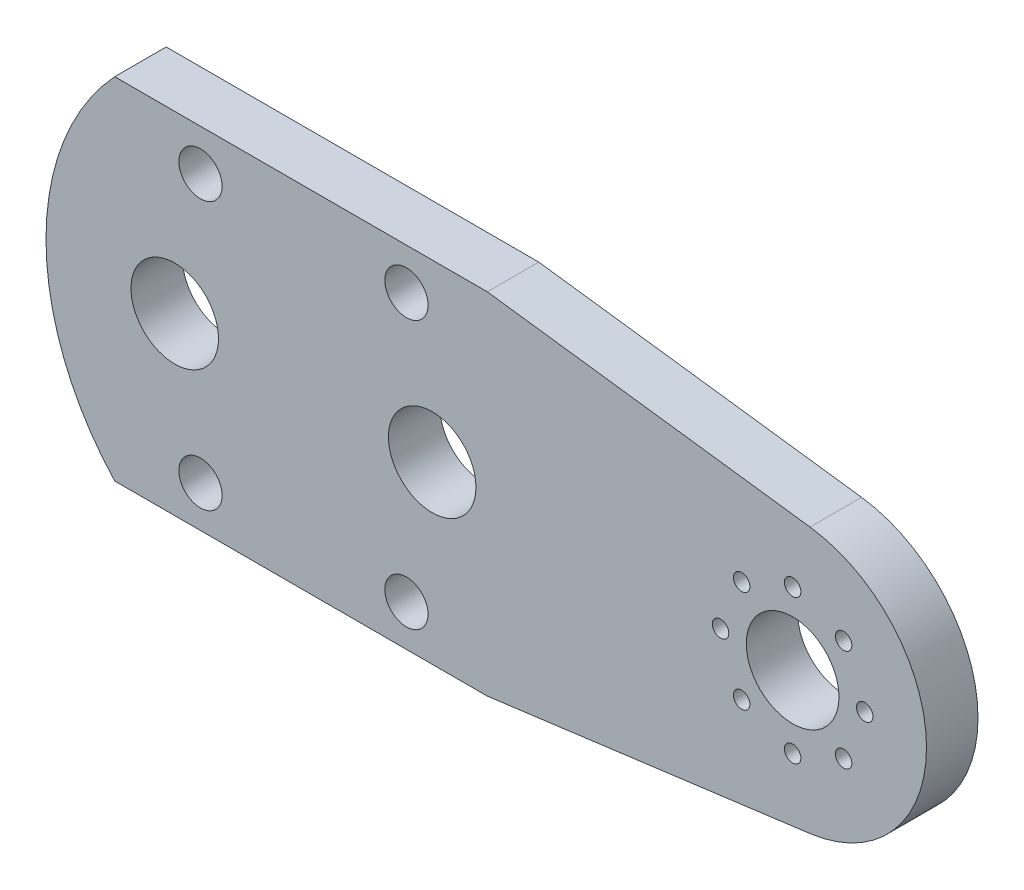
ISO-10303-21;
HEADER;
FILE_DESCRIPTION(('STEP AP214'),'2;1');
FILE_NAME('part.step','',(''),(''),'','','');
FILE_SCHEMA(('AUTOMOTIVE_DESIGN { 1 0 10303 214 1 1 1 1 }'));
ENDSEC;
DATA;
#1=APPLICATION_CONTEXT('core data for automotive mechanical design processes');
#2=APPLICATION_PROTOCOL_DEFINITION('international standard','automotive_design',2000,#1);
#3=PRODUCT_CONTEXT('',#1,'mechanical');
#4=PRODUCT('Part','Part','',(#3));
#5=PRODUCT_RELATED_PRODUCT_CATEGORY('part','',(#4));
#6=PRODUCT_DEFINITION_FORMATION('','',#4);
#7=PRODUCT_DEFINITION_CONTEXT('part definition',#1,'design');
#8=PRODUCT_DEFINITION('design','',#6,#7);
#9=PRODUCT_DEFINITION_SHAPE('','',#8);
#10=(LENGTH_UNIT() NAMED_UNIT(*) SI_UNIT(.MILLI.,.METRE.));
#11=(NAMED_UNIT(*) PLANE_ANGLE_UNIT() SI_UNIT($,.RADIAN.));
#12=(NAMED_UNIT(*) SI_UNIT($,.STERADIAN.) SOLID_ANGLE_UNIT());
#13=UNCERTAINTY_MEASURE_WITH_UNIT(LENGTH_MEASURE(1.E-05),#10,'distance_accuracy_value','');
#14=(GEOMETRIC_REPRESENTATION_CONTEXT(3) GLOBAL_UNCERTAINTY_ASSIGNED_CONTEXT((#13)) GLOBAL_UNIT_ASSIGNED_CONTEXT((#10,
#11,#12)) REPRESENTATION_CONTEXT('',''));
#15=CARTESIAN_POINT('',(0.,0.,0.));
#16=DIRECTION('',(0.,0.,1.));
#17=DIRECTION('',(1.,0.,0.));
#18=AXIS2_PLACEMENT_3D('',#15,#16,#17);
#19=CARTESIAN_POINT('',(2.28268021658433,-17.4028007841061,5.));
#20=DIRECTION('',(-0.130053398949487,0.991506991110847,0.));
#21=DIRECTION('',(-0.991506991110847,-0.130053398949487,0.));
#22=AXIS2_PLACEMENT_3D('',#19,#20,#21);
#23=PLANE('',#22);
#24=DIRECTION('',(0.991506991110847,0.130053398949487,0.));
#25=VECTOR('',#24,1.);
#26=CARTESIAN_POINT('',(2.28268021658433,-17.4028007841061,0.));
#27=LINE('',#26,#25);
#28=CARTESIAN_POINT('',(5.35357107135713,-17.,0.));
#29=VERTEX_POINT('',#28);
#30=CARTESIAN_POINT('',(36.6906941863433,-12.889590884441,0.));
#31=VERTEX_POINT('',#30);
#32=EDGE_CURVE('E165',#29,#31,#27,.T.);
#33=ORIENTED_EDGE('',*,*,#32,.T.);
#34=DIRECTION('',(0.,0.,-1.));
#35=VECTOR('',#34,1.);
#36=CARTESIAN_POINT('',(36.6906941863433,-12.889590884441,5.));
#37=LINE('',#36,#35);
#38=CARTESIAN_POINT('',(36.6906941863433,-12.889590884441,5.));
#39=VERTEX_POINT('',#38);
#40=EDGE_CURVE('E11',#39,#31,#37,.T.);
#41=ORIENTED_EDGE('',*,*,#40,.F.);
#42=DIRECTION('',(0.991506991110847,0.130053398949487,0.));
#43=VECTOR('',#42,1.);
#44=CARTESIAN_POINT('',(2.28268021658433,-17.4028007841061,5.));
#45=LINE('',#44,#43);
#46=CARTESIAN_POINT('',(5.35357107135713,-17.,5.));
#47=VERTEX_POINT('',#46);
#48=EDGE_CURVE('E218',#47,#39,#45,.T.);
#49=ORIENTED_EDGE('',*,*,#48,.F.);
#50=DIRECTION('',(0.,0.,-1.));
#51=VECTOR('',#50,1.);
#52=CARTESIAN_POINT('',(5.35357107135713,-17.,5.));
#53=LINE('',#52,#51);
#54=EDGE_CURVE('E146',#47,#29,#53,.T.);
#55=ORIENTED_EDGE('',*,*,#54,.T.);
#56=EDGE_LOOP('',(#33,#41,#49,#55));
#57=FACE_BOUND('',#56,.T.);
#58=ADVANCED_FACE('F34',(#57),#23,.F.);
#59=CARTESIAN_POINT('',(35.,0.,5.));
#60=DIRECTION('',(0.,0.,-1.));
#61=DIRECTION('',(-1.,0.,0.));
#62=AXIS2_PLACEMENT_3D('',#59,#60,#61);
#63=CYLINDRICAL_SURFACE('',#62,13.);
#64=CARTESIAN_POINT('',(35.,0.,0.));
#65=DIRECTION('',(0.,0.,1.));
#66=DIRECTION('',(1.,0.,0.));
#67=AXIS2_PLACEMENT_3D('',#64,#65,#66);
#68=CIRCLE('',#67,13.);
#69=CARTESIAN_POINT('',(36.6906941863433,12.889590884441,0.));
#70=VERTEX_POINT('',#69);
#71=EDGE_CURVE('E168',#31,#70,#68,.T.);
#72=ORIENTED_EDGE('',*,*,#71,.T.);
#73=DIRECTION('',(0.,0.,-1.));
#74=VECTOR('',#73,1.);
#75=CARTESIAN_POINT('',(36.6906941863433,12.889590884441,5.));
#76=LINE('',#75,#74);
#77=CARTESIAN_POINT('',(36.6906941863433,12.889590884441,5.));
#78=VERTEX_POINT('',#77);
#79=EDGE_CURVE('E43',#78,#70,#76,.T.);
#80=ORIENTED_EDGE('',*,*,#79,.F.);
#81=CARTESIAN_POINT('',(35.,0.,5.));
#82=DIRECTION('',(0.,0.,1.));
#83=DIRECTION('',(1.,0.,0.));
#84=AXIS2_PLACEMENT_3D('',#81,#82,#83);
#85=CIRCLE('',#84,13.);
#86=EDGE_CURVE('E87',#39,#78,#85,.T.);
#87=ORIENTED_EDGE('',*,*,#86,.F.);
#88=ORIENTED_EDGE('',*,*,#40,.T.);
#89=EDGE_LOOP('',(#72,#80,#87,#88));
#90=FACE_BOUND('',#89,.T.);
#91=ADVANCED_FACE('F210',(#90),#63,.T.);
#92=CARTESIAN_POINT('',(2.28268021658433,17.4028007841061,5.));
#93=DIRECTION('',(0.130053398949487,0.991506991110847,0.));
#94=DIRECTION('',(-0.991506991110847,0.130053398949487,0.));
#95=AXIS2_PLACEMENT_3D('',#92,#93,#94);
#96=PLANE('',#95);
#97=DIRECTION('',(0.991506991110847,-0.130053398949487,0.));
#98=VECTOR('',#97,1.);
#99=CARTESIAN_POINT('',(2.28268021658433,17.4028007841061,0.));
#100=LINE('',#99,#98);
#101=CARTESIAN_POINT('',(5.35357107135713,17.,0.));
#102=VERTEX_POINT('',#101);
#103=EDGE_CURVE('E171',#102,#70,#100,.T.);
#104=ORIENTED_EDGE('',*,*,#103,.F.);
#105=DIRECTION('',(0.,0.,-1.));
#106=VECTOR('',#105,1.);
#107=CARTESIAN_POINT('',(5.35357107135713,17.,5.));
#108=LINE('',#107,#106);
#109=CARTESIAN_POINT('',(5.35357107135713,17.,5.));
#110=VERTEX_POINT('',#109);
#111=EDGE_CURVE('E103',#110,#102,#108,.T.);
#112=ORIENTED_EDGE('',*,*,#111,.F.);
#113=DIRECTION('',(0.991506991110847,-0.130053398949487,0.));
#114=VECTOR('',#113,1.);
#115=CARTESIAN_POINT('',(2.28268021658433,17.4028007841061,5.));
#116=LINE('',#115,#114);
#117=EDGE_CURVE('E113',#110,#78,#116,.T.);
#118=ORIENTED_EDGE('',*,*,#117,.T.);
#119=ORIENTED_EDGE('',*,*,#79,.T.);
#120=EDGE_LOOP('',(#104,#112,#118,#119));
#121=FACE_BOUND('',#120,.T.);
#122=ADVANCED_FACE('F209',(#121),#96,.T.);
#123=CARTESIAN_POINT('',(0.,17.,5.));
#124=DIRECTION('',(0.,1.,0.));
#125=DIRECTION('',(0.,0.,1.));
#126=AXIS2_PLACEMENT_3D('',#123,#124,#125);
#127=PLANE('',#126);
#128=DIRECTION('',(1.,0.,0.));
#129=VECTOR('',#128,1.);
#130=CARTESIAN_POINT('',(0.,17.,0.));
#131=LINE('',#130,#129);
#132=CARTESIAN_POINT('',(-30.8303027798234,17.,0.));
#133=VERTEX_POINT('',#132);
#134=EDGE_CURVE('E102',#133,#102,#131,.T.);
#135=ORIENTED_EDGE('',*,*,#134,.F.);
#136=DIRECTION('',(0.,0.,-1.));
#137=VECTOR('',#136,1.);
#138=CARTESIAN_POINT('',(-30.8303027798234,17.,5.));
#139=LINE('',#138,#137);
#140=CARTESIAN_POINT('',(-30.8303027798234,17.,5.));
#141=VERTEX_POINT('',#140);
#142=EDGE_CURVE('E96',#141,#133,#139,.T.);
#143=ORIENTED_EDGE('',*,*,#142,.F.);
#144=DIRECTION('',(1.,0.,0.));
#145=VECTOR('',#144,1.);
#146=CARTESIAN_POINT('',(0.,17.,5.));
#147=LINE('',#146,#145);
#148=EDGE_CURVE('E100',#141,#110,#147,.T.);
#149=ORIENTED_EDGE('',*,*,#148,.T.);
#150=ORIENTED_EDGE('',*,*,#111,.T.);
#151=EDGE_LOOP('',(#135,#143,#149,#150));
#152=FACE_BOUND('',#151,.T.);
#153=ADVANCED_FACE('F98',(#152),#127,.T.);
#154=CARTESIAN_POINT('',(-12.5,0.,5.));
#155=DIRECTION('',(0.,0.,-1.));
#156=DIRECTION('',(-1.,0.,0.));
#157=AXIS2_PLACEMENT_3D('',#154,#155,#156);
#158=CYLINDRICAL_SURFACE('',#157,25.);
#159=CARTESIAN_POINT('',(-12.5,0.,0.));
#160=DIRECTION('',(0.,0.,1.));
#161=DIRECTION('',(1.,0.,0.));
#162=AXIS2_PLACEMENT_3D('',#159,#160,#161);
#163=CIRCLE('',#162,25.);
#164=CARTESIAN_POINT('',(-30.8303027798234,-17.,0.));
#165=VERTEX_POINT('',#164);
#166=EDGE_CURVE('E73',#133,#165,#163,.T.);
#167=ORIENTED_EDGE('',*,*,#166,.T.);
#168=DIRECTION('',(0.,0.,-1.));
#169=VECTOR('',#168,1.);
#170=CARTESIAN_POINT('',(-30.8303027798234,-17.,5.));
#171=LINE('',#170,#169);
#172=CARTESIAN_POINT('',(-30.8303027798234,-17.,5.));
#173=VERTEX_POINT('',#172);
#174=EDGE_CURVE('E104',#173,#165,#171,.T.);
#175=ORIENTED_EDGE('',*,*,#174,.F.);
#176=CARTESIAN_POINT('',(-12.5,0.,5.));
#177=DIRECTION('',(0.,0.,1.));
#178=DIRECTION('',(1.,0.,0.));
#179=AXIS2_PLACEMENT_3D('',#176,#177,#178);
#180=CIRCLE('',#179,25.);
#181=EDGE_CURVE('E106',#141,#173,#180,.T.);
#182=ORIENTED_EDGE('',*,*,#181,.F.);
#183=ORIENTED_EDGE('',*,*,#142,.T.);
#184=EDGE_LOOP('',(#167,#175,#182,#183));
#185=FACE_BOUND('',#184,.T.);
#186=ADVANCED_FACE('F107',(#185),#158,.T.);
#187=CARTESIAN_POINT('',(30.0502525316942,4.94974746830584,5.));
#188=DIRECTION('',(0.,0.,-1.));
#189=DIRECTION('',(-1.,0.,0.));
#190=AXIS2_PLACEMENT_3D('',#187,#188,#189);
#191=CYLINDRICAL_SURFACE('',#190,0.800000000000002);
#192=CARTESIAN_POINT('',(30.0502525316942,4.94974746830584,5.));
#193=DIRECTION('',(0.,0.,1.));
#194=DIRECTION('',(1.,0.,0.));
#195=AXIS2_PLACEMENT_3D('',#192,#193,#194);
#196=CIRCLE('',#195,0.800000000000002);
#197=CARTESIAN_POINT('',(30.8502525316942,4.94974746830584,5.));
#198=VERTEX_POINT('',#197);
#199=EDGE_CURVE('E140',#198,#198,#196,.T.);
#200=ORIENTED_EDGE('',*,*,#199,.T.);
#201=EDGE_LOOP('',(#200));
#202=FACE_BOUND('',#201,.T.);
#203=CARTESIAN_POINT('',(30.0502525316942,4.94974746830584,0.));
#204=DIRECTION('',(0.,0.,1.));
#205=DIRECTION('',(1.,0.,0.));
#206=AXIS2_PLACEMENT_3D('',#203,#204,#205);
#207=CIRCLE('',#206,0.800000000000002);
#208=CARTESIAN_POINT('',(30.8502525316942,4.94974746830584,0.));
#209=VERTEX_POINT('',#208);
#210=EDGE_CURVE('E198',#209,#209,#207,.T.);
#211=ORIENTED_EDGE('',*,*,#210,.F.);
#212=EDGE_LOOP('',(#211));
#213=FACE_BOUND('',#212,.T.);
#214=ADVANCED_FACE('F292',(#202,#213),#191,.F.);
#215=CARTESIAN_POINT('',(28.,0.,5.));
#216=DIRECTION('',(0.,0.,-1.));
#217=DIRECTION('',(-1.,0.,0.));
#218=AXIS2_PLACEMENT_3D('',#215,#216,#217);
#219=CYLINDRICAL_SURFACE('',#218,0.8);
#220=CARTESIAN_POINT('',(28.,0.,5.));
#221=DIRECTION('',(0.,0.,1.));
#222=DIRECTION('',(1.,0.,0.));
#223=AXIS2_PLACEMENT_3D('',#220,#221,#222);
#224=CIRCLE('',#223,0.8);
#225=CARTESIAN_POINT('',(28.8,0.,5.));
#226=VERTEX_POINT('',#225);
#227=EDGE_CURVE('E137',#226,#226,#224,.T.);
#228=ORIENTED_EDGE('',*,*,#227,.T.);
#229=EDGE_LOOP('',(#228));
#230=FACE_BOUND('',#229,.T.);
#231=CARTESIAN_POINT('',(28.,0.,0.));
#232=DIRECTION('',(0.,0.,1.));
#233=DIRECTION('',(1.,0.,0.));
#234=AXIS2_PLACEMENT_3D('',#231,#232,#233);
#235=CIRCLE('',#234,0.8);
#236=CARTESIAN_POINT('',(28.8,0.,0.));
#237=VERTEX_POINT('',#236);
#238=EDGE_CURVE('E195',#237,#237,#235,.T.);
#239=ORIENTED_EDGE('',*,*,#238,.F.);
#240=EDGE_LOOP('',(#239));
#241=FACE_BOUND('',#240,.T.);
#242=ADVANCED_FACE('F295',(#230,#241),#219,.F.);
#243=CARTESIAN_POINT('',(30.0502525316941,-4.94974746830577,5.));
#244=DIRECTION('',(0.,0.,-1.));
#245=DIRECTION('',(-1.,0.,0.));
#246=AXIS2_PLACEMENT_3D('',#243,#244,#245);
#247=CYLINDRICAL_SURFACE('',#246,0.800000000000002);
#248=CARTESIAN_POINT('',(30.0502525316941,-4.94974746830577,5.));
#249=DIRECTION('',(0.,0.,1.));
#250=DIRECTION('',(1.,0.,0.));
#251=AXIS2_PLACEMENT_3D('',#248,#249,#250);
#252=CIRCLE('',#251,0.800000000000002);
#253=CARTESIAN_POINT('',(30.8502525316941,-4.94974746830577,5.));
#254=VERTEX_POINT('',#253);
#255=EDGE_CURVE('E134',#254,#254,#252,.T.);
#256=ORIENTED_EDGE('',*,*,#255,.T.);
#257=EDGE_LOOP('',(#256));
#258=FACE_BOUND('',#257,.T.);
#259=CARTESIAN_POINT('',(30.0502525316941,-4.94974746830577,0.));
#260=DIRECTION('',(0.,0.,1.));
#261=DIRECTION('',(1.,0.,0.));
#262=AXIS2_PLACEMENT_3D('',#259,#260,#261);
#263=CIRCLE('',#262,0.800000000000002);
#264=CARTESIAN_POINT('',(30.8502525316941,-4.94974746830577,0.));
#265=VERTEX_POINT('',#264);
#266=EDGE_CURVE('E192',#265,#265,#263,.T.);
#267=ORIENTED_EDGE('',*,*,#266,.F.);
#268=EDGE_LOOP('',(#267));
#269=FACE_BOUND('',#268,.T.);
#270=ADVANCED_FACE('F299',(#258,#269),#247,.F.);
#271=CARTESIAN_POINT('',(34.9999999999999,-7.,5.));
#272=DIRECTION('',(0.,0.,-1.));
#273=DIRECTION('',(-1.,0.,0.));
#274=AXIS2_PLACEMENT_3D('',#271,#272,#273);
#275=CYLINDRICAL_SURFACE('',#274,0.799999999999999);
#276=CARTESIAN_POINT('',(34.9999999999999,-7.,5.));
#277=DIRECTION('',(0.,0.,1.));
#278=DIRECTION('',(1.,0.,0.));
#279=AXIS2_PLACEMENT_3D('',#276,#277,#278);
#280=CIRCLE('',#279,0.799999999999999);
#281=CARTESIAN_POINT('',(35.7999999999999,-7.,5.));
#282=VERTEX_POINT('',#281);
#283=EDGE_CURVE('E131',#282,#282,#280,.T.);
#284=ORIENTED_EDGE('',*,*,#283,.T.);
#285=EDGE_LOOP('',(#284));
#286=FACE_BOUND('',#285,.T.);
#287=CARTESIAN_POINT('',(34.9999999999999,-7.,0.));
#288=DIRECTION('',(0.,0.,1.));
#289=DIRECTION('',(1.,0.,0.));
#290=AXIS2_PLACEMENT_3D('',#287,#288,#289);
#291=CIRCLE('',#290,0.799999999999999);
#292=CARTESIAN_POINT('',(35.7999999999999,-7.,0.));
#293=VERTEX_POINT('',#292);
#294=EDGE_CURVE('E189',#293,#293,#291,.T.);
#295=ORIENTED_EDGE('',*,*,#294,.F.);
#296=EDGE_LOOP('',(#295));
#297=FACE_BOUND('',#296,.T.);
#298=ADVANCED_FACE('F303',(#286,#297),#275,.F.);
#299=CARTESIAN_POINT('',(39.9497474683058,-4.94974746830588,5.));
#300=DIRECTION('',(0.,0.,-1.));
#301=DIRECTION('',(-1.,0.,0.));
#302=AXIS2_PLACEMENT_3D('',#299,#300,#301);
#303=CYLINDRICAL_SURFACE('',#302,0.799999999999999);
#304=CARTESIAN_POINT('',(39.9497474683058,-4.94974746830588,5.));
#305=DIRECTION('',(0.,0.,1.));
#306=DIRECTION('',(1.,0.,0.));
#307=AXIS2_PLACEMENT_3D('',#304,#305,#306);
#308=CIRCLE('',#307,0.799999999999999);
#309=CARTESIAN_POINT('',(40.7497474683058,-4.94974746830588,5.));
#310=VERTEX_POINT('',#309);
#311=EDGE_CURVE('E128',#310,#310,#308,.T.);
#312=ORIENTED_EDGE('',*,*,#311,.T.);
#313=EDGE_LOOP('',(#312));
#314=FACE_BOUND('',#313,.T.);
#315=CARTESIAN_POINT('',(39.9497474683058,-4.94974746830588,0.));
#316=DIRECTION('',(0.,0.,1.));
#317=DIRECTION('',(1.,0.,0.));
#318=AXIS2_PLACEMENT_3D('',#315,#316,#317);
#319=CIRCLE('',#318,0.799999999999999);
#320=CARTESIAN_POINT('',(40.7497474683058,-4.94974746830588,0.));
#321=VERTEX_POINT('',#320);
#322=EDGE_CURVE('E186',#321,#321,#319,.T.);
#323=ORIENTED_EDGE('',*,*,#322,.F.);
#324=EDGE_LOOP('',(#323));
#325=FACE_BOUND('',#324,.T.);
#326=ADVANCED_FACE('F307',(#314,#325),#303,.F.);
#327=CARTESIAN_POINT('',(42.,0.,5.));
#328=DIRECTION('',(0.,0.,-1.));
#329=DIRECTION('',(-1.,0.,0.));
#330=AXIS2_PLACEMENT_3D('',#327,#328,#329);
#331=CYLINDRICAL_SURFACE('',#330,0.800000000000002);
#332=CARTESIAN_POINT('',(42.,0.,5.));
#333=DIRECTION('',(0.,0.,1.));
#334=DIRECTION('',(1.,0.,0.));
#335=AXIS2_PLACEMENT_3D('',#332,#333,#334);
#336=CIRCLE('',#335,0.800000000000002);
#337=CARTESIAN_POINT('',(42.8,0.,5.));
#338=VERTEX_POINT('',#337);
#339=EDGE_CURVE('E125',#338,#338,#336,.T.);
#340=ORIENTED_EDGE('',*,*,#339,.T.);
#341=EDGE_LOOP('',(#340));
#342=FACE_BOUND('',#341,.T.);
#343=CARTESIAN_POINT('',(42.,0.,0.));
#344=DIRECTION('',(0.,0.,1.));
#345=DIRECTION('',(1.,0.,0.));
#346=AXIS2_PLACEMENT_3D('',#343,#344,#345);
#347=CIRCLE('',#346,0.800000000000002);
#348=CARTESIAN_POINT('',(42.8,0.,0.));
#349=VERTEX_POINT('',#348);
#350=EDGE_CURVE('E183',#349,#349,#347,.T.);
#351=ORIENTED_EDGE('',*,*,#350,.F.);
#352=EDGE_LOOP('',(#351));
#353=FACE_BOUND('',#352,.T.);
#354=ADVANCED_FACE('F311',(#342,#353),#331,.F.);
#355=CARTESIAN_POINT('',(39.9497474683059,4.9497474683058,5.));
#356=DIRECTION('',(0.,0.,-1.));
#357=DIRECTION('',(-1.,0.,0.));
#358=AXIS2_PLACEMENT_3D('',#355,#356,#357);
#359=CYLINDRICAL_SURFACE('',#358,0.799999999999999);
#360=CARTESIAN_POINT('',(39.9497474683059,4.9497474683058,5.));
#361=DIRECTION('',(0.,0.,1.));
#362=DIRECTION('',(1.,0.,0.));
#363=AXIS2_PLACEMENT_3D('',#360,#361,#362);
#364=CIRCLE('',#363,0.799999999999999);
#365=CARTESIAN_POINT('',(40.7497474683059,4.9497474683058,5.));
#366=VERTEX_POINT('',#365);
#367=EDGE_CURVE('E122',#366,#366,#364,.T.);
#368=ORIENTED_EDGE('',*,*,#367,.T.);
#369=EDGE_LOOP('',(#368));
#370=FACE_BOUND('',#369,.T.);
#371=CARTESIAN_POINT('',(39.9497474683059,4.9497474683058,0.));
#372=DIRECTION('',(0.,0.,1.));
#373=DIRECTION('',(1.,0.,0.));
#374=AXIS2_PLACEMENT_3D('',#371,#372,#373);
#375=CIRCLE('',#374,0.799999999999999);
#376=CARTESIAN_POINT('',(40.7497474683059,4.9497474683058,0.));
#377=VERTEX_POINT('',#376);
#378=EDGE_CURVE('E180',#377,#377,#375,.T.);
#379=ORIENTED_EDGE('',*,*,#378,.F.);
#380=EDGE_LOOP('',(#379));
#381=FACE_BOUND('',#380,.T.);
#382=ADVANCED_FACE('F231',(#370,#381),#359,.F.);
#383=CARTESIAN_POINT('',(35.,7.,5.));
#384=DIRECTION('',(0.,0.,-1.));
#385=DIRECTION('',(-1.,0.,0.));
#386=AXIS2_PLACEMENT_3D('',#383,#384,#385);
#387=CYLINDRICAL_SURFACE('',#386,0.800000000000002);
#388=CARTESIAN_POINT('',(35.,7.,5.));
#389=DIRECTION('',(0.,0.,1.));
#390=DIRECTION('',(1.,0.,0.));
#391=AXIS2_PLACEMENT_3D('',#388,#389,#390);
#392=CIRCLE('',#391,0.800000000000002);
#393=CARTESIAN_POINT('',(35.8,7.,5.));
#394=VERTEX_POINT('',#393);
#395=EDGE_CURVE('E119',#394,#394,#392,.T.);
#396=ORIENTED_EDGE('',*,*,#395,.T.);
#397=EDGE_LOOP('',(#396));
#398=FACE_BOUND('',#397,.T.);
#399=CARTESIAN_POINT('',(35.,7.,0.));
#400=DIRECTION('',(0.,0.,1.));
#401=DIRECTION('',(1.,0.,0.));
#402=AXIS2_PLACEMENT_3D('',#399,#400,#401);
#403=CIRCLE('',#402,0.800000000000002);
#404=CARTESIAN_POINT('',(35.8,7.,0.));
#405=VERTEX_POINT('',#404);
#406=EDGE_CURVE('E177',#405,#405,#403,.T.);
#407=ORIENTED_EDGE('',*,*,#406,.F.);
#408=EDGE_LOOP('',(#407));
#409=FACE_BOUND('',#408,.T.);
#410=ADVANCED_FACE('F222',(#398,#409),#387,.F.);
#411=CARTESIAN_POINT('',(0.,-17.,5.));
#412=DIRECTION('',(0.,1.,0.));
#413=DIRECTION('',(0.,0.,1.));
#414=AXIS2_PLACEMENT_3D('',#411,#412,#413);
#415=PLANE('',#414);
#416=DIRECTION('',(1.,0.,0.));
#417=VECTOR('',#416,1.);
#418=CARTESIAN_POINT('',(0.,-17.,0.));
#419=LINE('',#418,#417);
#420=EDGE_CURVE('E79',#165,#29,#419,.T.);
#421=ORIENTED_EDGE('',*,*,#420,.T.);
#422=ORIENTED_EDGE('',*,*,#54,.F.);
#423=DIRECTION('',(1.,0.,0.));
#424=VECTOR('',#423,1.);
#425=CARTESIAN_POINT('',(0.,-17.,5.));
#426=LINE('',#425,#424);
#427=EDGE_CURVE('E51',#173,#47,#426,.T.);
#428=ORIENTED_EDGE('',*,*,#427,.F.);
#429=ORIENTED_EDGE('',*,*,#174,.T.);
#430=EDGE_LOOP('',(#421,#422,#428,#429));
#431=FACE_BOUND('',#430,.T.);
#432=ADVANCED_FACE('F219',(#431),#415,.F.);
#433=CARTESIAN_POINT('',(-2.5,-13.,5.));
#434=DIRECTION('',(0.,0.,-1.));
#435=DIRECTION('',(-1.,0.,0.));
#436=AXIS2_PLACEMENT_3D('',#433,#434,#435);
#437=CYLINDRICAL_SURFACE('',#436,2.1);
#438=CARTESIAN_POINT('',(-2.5,-13.,5.));
#439=DIRECTION('',(0.,0.,1.));
#440=DIRECTION('',(1.,0.,0.));
#441=AXIS2_PLACEMENT_3D('',#438,#439,#440);
#442=CIRCLE('',#441,2.1);
#443=CARTESIAN_POINT('',(-0.399999999999998,-13.,5.));
#444=VERTEX_POINT('',#443);
#445=EDGE_CURVE('E544',#444,#444,#442,.F.);
#446=ORIENTED_EDGE('',*,*,#445,.F.);
#447=EDGE_LOOP('',(#446));
#448=FACE_BOUND('',#447,.T.);
#449=CARTESIAN_POINT('',(-2.5,-13.,0.));
#450=DIRECTION('',(0.,0.,1.));
#451=DIRECTION('',(1.,0.,0.));
#452=AXIS2_PLACEMENT_3D('',#449,#450,#451);
#453=CIRCLE('',#452,2.1);
#454=CARTESIAN_POINT('',(-0.399999999999998,-13.,0.));
#455=VERTEX_POINT('',#454);
#456=EDGE_CURVE('E162',#455,#455,#453,.F.);
#457=ORIENTED_EDGE('',*,*,#456,.T.);
#458=EDGE_LOOP('',(#457));
#459=FACE_BOUND('',#458,.T.);
#460=ADVANCED_FACE('F221',(#448,#459),#437,.F.);
#461=CARTESIAN_POINT('',(-22.5,-13.,5.));
#462=DIRECTION('',(0.,0.,-1.));
#463=DIRECTION('',(-1.,0.,0.));
#464=AXIS2_PLACEMENT_3D('',#461,#462,#463);
#465=CYLINDRICAL_SURFACE('',#464,2.1);
#466=CARTESIAN_POINT('',(-22.5,-13.,5.));
#467=DIRECTION('',(0.,0.,1.));
#468=DIRECTION('',(1.,0.,0.));
#469=AXIS2_PLACEMENT_3D('',#466,#467,#468);
#470=CIRCLE('',#469,2.1);
#471=CARTESIAN_POINT('',(-20.4,-13.,5.));
#472=VERTEX_POINT('',#471);
#473=EDGE_CURVE('E541',#472,#472,#470,.T.);
#474=ORIENTED_EDGE('',*,*,#473,.T.);
#475=EDGE_LOOP('',(#474));
#476=FACE_BOUND('',#475,.T.);
#477=CARTESIAN_POINT('',(-22.5,-13.,0.));
#478=DIRECTION('',(0.,0.,1.));
#479=DIRECTION('',(1.,0.,0.));
#480=AXIS2_PLACEMENT_3D('',#477,#478,#479);
#481=CIRCLE('',#480,2.1);
#482=CARTESIAN_POINT('',(-20.4,-13.,0.));
#483=VERTEX_POINT('',#482);
#484=EDGE_CURVE('E159',#483,#483,#481,.T.);
#485=ORIENTED_EDGE('',*,*,#484,.F.);
#486=EDGE_LOOP('',(#485));
#487=FACE_BOUND('',#486,.T.);
#488=ADVANCED_FACE('F228',(#476,#487),#465,.F.);
#489=CARTESIAN_POINT('',(-25.,0.,5.));
#490=DIRECTION('',(0.,0.,-1.));
#491=DIRECTION('',(-1.,0.,0.));
#492=AXIS2_PLACEMENT_3D('',#489,#490,#491);
#493=CYLINDRICAL_SURFACE('',#492,4.25);
#494=CARTESIAN_POINT('',(-25.,0.,5.));
#495=DIRECTION('',(0.,0.,1.));
#496=DIRECTION('',(1.,0.,0.));
#497=AXIS2_PLACEMENT_3D('',#494,#495,#496);
#498=CIRCLE('',#497,4.25);
#499=CARTESIAN_POINT('',(-20.75,0.,5.));
#500=VERTEX_POINT('',#499);
#501=EDGE_CURVE('E537',#500,#500,#498,.T.);
#502=ORIENTED_EDGE('',*,*,#501,.T.);
#503=EDGE_LOOP('',(#502));
#504=FACE_BOUND('',#503,.T.);
#505=CARTESIAN_POINT('',(-25.,0.,0.));
#506=DIRECTION('',(0.,0.,1.));
#507=DIRECTION('',(1.,0.,0.));
#508=AXIS2_PLACEMENT_3D('',#505,#506,#507);
#509=CIRCLE('',#508,4.25);
#510=CARTESIAN_POINT('',(-20.75,0.,0.));
#511=VERTEX_POINT('',#510);
#512=EDGE_CURVE('E156',#511,#511,#509,.T.);
#513=ORIENTED_EDGE('',*,*,#512,.F.);
#514=EDGE_LOOP('',(#513));
#515=FACE_BOUND('',#514,.T.);
#516=ADVANCED_FACE('F245',(#504,#515),#493,.F.);
#517=CARTESIAN_POINT('',(0.,0.,5.));
#518=DIRECTION('',(0.,0.,-1.));
#519=DIRECTION('',(-1.,0.,0.));
#520=AXIS2_PLACEMENT_3D('',#517,#518,#519);
#521=CYLINDRICAL_SURFACE('',#520,4.25);
#522=CARTESIAN_POINT('',(0.,0.,5.));
#523=DIRECTION('',(0.,0.,1.));
#524=DIRECTION('',(1.,0.,0.));
#525=AXIS2_PLACEMENT_3D('',#522,#523,#524);
#526=CIRCLE('',#525,4.25);
#527=CARTESIAN_POINT('',(4.25,0.,5.));
#528=VERTEX_POINT('',#527);
#529=EDGE_CURVE('E533',#528,#528,#526,.T.);
#530=ORIENTED_EDGE('',*,*,#529,.T.);
#531=EDGE_LOOP('',(#530));
#532=FACE_BOUND('',#531,.T.);
#533=CARTESIAN_POINT('',(0.,0.,0.));
#534=DIRECTION('',(0.,0.,1.));
#535=DIRECTION('',(1.,0.,0.));
#536=AXIS2_PLACEMENT_3D('',#533,#534,#535);
#537=CIRCLE('',#536,4.25);
#538=CARTESIAN_POINT('',(4.25,0.,0.));
#539=VERTEX_POINT('',#538);
#540=EDGE_CURVE('E153',#539,#539,#537,.T.);
#541=ORIENTED_EDGE('',*,*,#540,.F.);
#542=EDGE_LOOP('',(#541));
#543=FACE_BOUND('',#542,.T.);
#544=ADVANCED_FACE('F249',(#532,#543),#521,.F.);
#545=CARTESIAN_POINT('',(-2.5,13.,5.));
#546=DIRECTION('',(0.,0.,-1.));
#547=DIRECTION('',(-1.,0.,0.));
#548=AXIS2_PLACEMENT_3D('',#545,#546,#547);
#549=CYLINDRICAL_SURFACE('',#548,2.1);
#550=CARTESIAN_POINT('',(-2.5,13.,5.));
#551=DIRECTION('',(0.,0.,1.));
#552=DIRECTION('',(1.,0.,0.));
#553=AXIS2_PLACEMENT_3D('',#550,#551,#552);
#554=CIRCLE('',#553,2.1);
#555=CARTESIAN_POINT('',(-0.399999999999998,13.,5.));
#556=VERTEX_POINT('',#555);
#557=EDGE_CURVE('E264',#556,#556,#554,.T.);
#558=ORIENTED_EDGE('',*,*,#557,.T.);
#559=EDGE_LOOP('',(#558));
#560=FACE_BOUND('',#559,.T.);
#561=CARTESIAN_POINT('',(-2.5,13.,0.));
#562=DIRECTION('',(0.,0.,1.));
#563=DIRECTION('',(1.,0.,0.));
#564=AXIS2_PLACEMENT_3D('',#561,#562,#563);
#565=CIRCLE('',#564,2.1);
#566=CARTESIAN_POINT('',(-0.399999999999998,13.,0.));
#567=VERTEX_POINT('',#566);
#568=EDGE_CURVE('E150',#567,#567,#565,.T.);
#569=ORIENTED_EDGE('',*,*,#568,.F.);
#570=EDGE_LOOP('',(#569));
#571=FACE_BOUND('',#570,.T.);
#572=ADVANCED_FACE('F252',(#560,#571),#549,.F.);
#573=CARTESIAN_POINT('',(-22.5,13.,5.));
#574=DIRECTION('',(0.,0.,-1.));
#575=DIRECTION('',(-1.,0.,0.));
#576=AXIS2_PLACEMENT_3D('',#573,#574,#575);
#577=CYLINDRICAL_SURFACE('',#576,2.1);
#578=CARTESIAN_POINT('',(-22.5,13.,5.));
#579=DIRECTION('',(0.,0.,1.));
#580=DIRECTION('',(1.,0.,0.));
#581=AXIS2_PLACEMENT_3D('',#578,#579,#580);
#582=CIRCLE('',#581,2.1);
#583=CARTESIAN_POINT('',(-20.4,13.,5.));
#584=VERTEX_POINT('',#583);
#585=EDGE_CURVE('E204',#584,#584,#582,.F.);
#586=ORIENTED_EDGE('',*,*,#585,.F.);
#587=EDGE_LOOP('',(#586));
#588=FACE_BOUND('',#587,.T.);
#589=CARTESIAN_POINT('',(-22.5,13.,0.));
#590=DIRECTION('',(0.,0.,1.));
#591=DIRECTION('',(1.,0.,0.));
#592=AXIS2_PLACEMENT_3D('',#589,#590,#591);
#593=CIRCLE('',#592,2.1);
#594=CARTESIAN_POINT('',(-20.4,13.,0.));
#595=VERTEX_POINT('',#594);
#596=EDGE_CURVE('E147',#595,#595,#593,.F.);
#597=ORIENTED_EDGE('',*,*,#596,.T.);
#598=EDGE_LOOP('',(#597));
#599=FACE_BOUND('',#598,.T.);
#600=ADVANCED_FACE('F36',(#588,#599),#577,.F.);
#601=CARTESIAN_POINT('',(35.,0.,5.));
#602=DIRECTION('',(0.,0.,-1.));
#603=DIRECTION('',(-1.,0.,0.));
#604=AXIS2_PLACEMENT_3D('',#601,#602,#603);
#605=CYLINDRICAL_SURFACE('',#604,4.5);
#606=CARTESIAN_POINT('',(35.,0.,5.));
#607=DIRECTION('',(0.,0.,1.));
#608=DIRECTION('',(1.,0.,0.));
#609=AXIS2_PLACEMENT_3D('',#606,#607,#608);
#610=CIRCLE('',#609,4.5);
#611=CARTESIAN_POINT('',(39.5,0.,5.));
#612=VERTEX_POINT('',#611);
#613=EDGE_CURVE('E143',#612,#612,#610,.T.);
#614=ORIENTED_EDGE('',*,*,#613,.T.);
#615=EDGE_LOOP('',(#614));
#616=FACE_BOUND('',#615,.T.);
#617=CARTESIAN_POINT('',(35.,0.,0.));
#618=DIRECTION('',(0.,0.,1.));
#619=DIRECTION('',(1.,0.,0.));
#620=AXIS2_PLACEMENT_3D('',#617,#618,#619);
#621=CIRCLE('',#620,4.5);
#622=CARTESIAN_POINT('',(39.5,0.,0.));
#623=VERTEX_POINT('',#622);
#624=EDGE_CURVE('E201',#623,#623,#621,.T.);
#625=ORIENTED_EDGE('',*,*,#624,.F.);
#626=EDGE_LOOP('',(#625));
#627=FACE_BOUND('',#626,.T.);
#628=ADVANCED_FACE('F259',(#616,#627),#605,.F.);
#629=CARTESIAN_POINT('',(0.,0.,5.));
#630=DIRECTION('',(0.,0.,1.));
#631=DIRECTION('',(1.,0.,0.));
#632=AXIS2_PLACEMENT_3D('',#629,#630,#631);
#633=PLANE('',#632);
#634=ORIENTED_EDGE('',*,*,#585,.T.);
#635=EDGE_LOOP('',(#634));
#636=FACE_BOUND('',#635,.T.);
#637=ORIENTED_EDGE('',*,*,#557,.F.);
#638=EDGE_LOOP('',(#637));
#639=FACE_BOUND('',#638,.T.);
#640=ORIENTED_EDGE('',*,*,#529,.F.);
#641=EDGE_LOOP('',(#640));
#642=FACE_BOUND('',#641,.T.);
#643=ORIENTED_EDGE('',*,*,#501,.F.);
#644=EDGE_LOOP('',(#643));
#645=FACE_BOUND('',#644,.T.);
#646=ORIENTED_EDGE('',*,*,#473,.F.);
#647=EDGE_LOOP('',(#646));
#648=FACE_BOUND('',#647,.T.);
#649=ORIENTED_EDGE('',*,*,#445,.T.);
#650=EDGE_LOOP('',(#649));
#651=FACE_BOUND('',#650,.T.);
#652=ORIENTED_EDGE('',*,*,#48,.T.);
#653=ORIENTED_EDGE('',*,*,#86,.T.);
#654=ORIENTED_EDGE('',*,*,#117,.F.);
#655=ORIENTED_EDGE('',*,*,#148,.F.);
#656=ORIENTED_EDGE('',*,*,#181,.T.);
#657=ORIENTED_EDGE('',*,*,#427,.T.);
#658=EDGE_LOOP('',(#652,#653,#654,#655,#656,#657));
#659=FACE_BOUND('',#658,.T.);
#660=ORIENTED_EDGE('',*,*,#395,.F.);
#661=EDGE_LOOP('',(#660));
#662=FACE_BOUND('',#661,.T.);
#663=ORIENTED_EDGE('',*,*,#367,.F.);
#664=EDGE_LOOP('',(#663));
#665=FACE_BOUND('',#664,.T.);
#666=ORIENTED_EDGE('',*,*,#339,.F.);
#667=EDGE_LOOP('',(#666));
#668=FACE_BOUND('',#667,.T.);
#669=ORIENTED_EDGE('',*,*,#311,.F.);
#670=EDGE_LOOP('',(#669));
#671=FACE_BOUND('',#670,.T.);
#672=ORIENTED_EDGE('',*,*,#283,.F.);
#673=EDGE_LOOP('',(#672));
#674=FACE_BOUND('',#673,.T.);
#675=ORIENTED_EDGE('',*,*,#255,.F.);
#676=EDGE_LOOP('',(#675));
#677=FACE_BOUND('',#676,.T.);
#678=ORIENTED_EDGE('',*,*,#227,.F.);
#679=EDGE_LOOP('',(#678));
#680=FACE_BOUND('',#679,.T.);
#681=ORIENTED_EDGE('',*,*,#199,.F.);
#682=EDGE_LOOP('',(#681));
#683=FACE_BOUND('',#682,.T.);
#684=ORIENTED_EDGE('',*,*,#613,.F.);
#685=EDGE_LOOP('',(#684));
#686=FACE_BOUND('',#685,.T.);
#687=ADVANCED_FACE('F110',(#636,#639,#642,#645,#648,#651,#659,#662,#665,#668,#671,#674,#677,
#680,#683,#686),#633,.T.);
#688=CARTESIAN_POINT('',(0.,0.,0.));
#689=DIRECTION('',(0.,0.,1.));
#690=DIRECTION('',(1.,0.,0.));
#691=AXIS2_PLACEMENT_3D('',#688,#689,#690);
#692=PLANE('',#691);
#693=ORIENTED_EDGE('',*,*,#596,.F.);
#694=EDGE_LOOP('',(#693));
#695=FACE_BOUND('',#694,.T.);
#696=ORIENTED_EDGE('',*,*,#568,.T.);
#697=EDGE_LOOP('',(#696));
#698=FACE_BOUND('',#697,.T.);
#699=ORIENTED_EDGE('',*,*,#540,.T.);
#700=EDGE_LOOP('',(#699));
#701=FACE_BOUND('',#700,.T.);
#702=ORIENTED_EDGE('',*,*,#512,.T.);
#703=EDGE_LOOP('',(#702));
#704=FACE_BOUND('',#703,.T.);
#705=ORIENTED_EDGE('',*,*,#484,.T.);
#706=EDGE_LOOP('',(#705));
#707=FACE_BOUND('',#706,.T.);
#708=ORIENTED_EDGE('',*,*,#456,.F.);
#709=EDGE_LOOP('',(#708));
#710=FACE_BOUND('',#709,.T.);
#711=ORIENTED_EDGE('',*,*,#32,.F.);
#712=ORIENTED_EDGE('',*,*,#420,.F.);
#713=ORIENTED_EDGE('',*,*,#166,.F.);
#714=ORIENTED_EDGE('',*,*,#134,.T.);
#715=ORIENTED_EDGE('',*,*,#103,.T.);
#716=ORIENTED_EDGE('',*,*,#71,.F.);
#717=EDGE_LOOP('',(#711,#712,#713,#714,#715,#716));
#718=FACE_BOUND('',#717,.T.);
#719=ORIENTED_EDGE('',*,*,#406,.T.);
#720=EDGE_LOOP('',(#719));
#721=FACE_BOUND('',#720,.T.);
#722=ORIENTED_EDGE('',*,*,#378,.T.);
#723=EDGE_LOOP('',(#722));
#724=FACE_BOUND('',#723,.T.);
#725=ORIENTED_EDGE('',*,*,#350,.T.);
#726=EDGE_LOOP('',(#725));
#727=FACE_BOUND('',#726,.T.);
#728=ORIENTED_EDGE('',*,*,#322,.T.);
#729=EDGE_LOOP('',(#728));
#730=FACE_BOUND('',#729,.T.);
#731=ORIENTED_EDGE('',*,*,#294,.T.);
#732=EDGE_LOOP('',(#731));
#733=FACE_BOUND('',#732,.T.);
#734=ORIENTED_EDGE('',*,*,#266,.T.);
#735=EDGE_LOOP('',(#734));
#736=FACE_BOUND('',#735,.T.);
#737=ORIENTED_EDGE('',*,*,#238,.T.);
#738=EDGE_LOOP('',(#737));
#739=FACE_BOUND('',#738,.T.);
#740=ORIENTED_EDGE('',*,*,#210,.T.);
#741=EDGE_LOOP('',(#740));
#742=FACE_BOUND('',#741,.T.);
#743=ORIENTED_EDGE('',*,*,#624,.T.);
#744=EDGE_LOOP('',(#743));
#745=FACE_BOUND('',#744,.T.);
#746=ADVANCED_FACE('F214',(#695,#698,#701,#704,#707,#710,#718,#721,#724,#727,#730,#733,#736,
#739,#742,#745),#692,.F.);
#747=CLOSED_SHELL('',(#58,#91,#122,#153,#186,#214,#242,#270,#298,#326,#354,#382,#410,#432,#460,
#488,#516,#544,#572,#600,#628,#687,#746));
#748=MANIFOLD_SOLID_BREP('B2',#747);
#749=ADVANCED_BREP_SHAPE_REPRESENTATION('',(#18,#748),#14);
#750=SHAPE_DEFINITION_REPRESENTATION(#9,#749);
ENDSEC;
END-ISO-10303-21;
